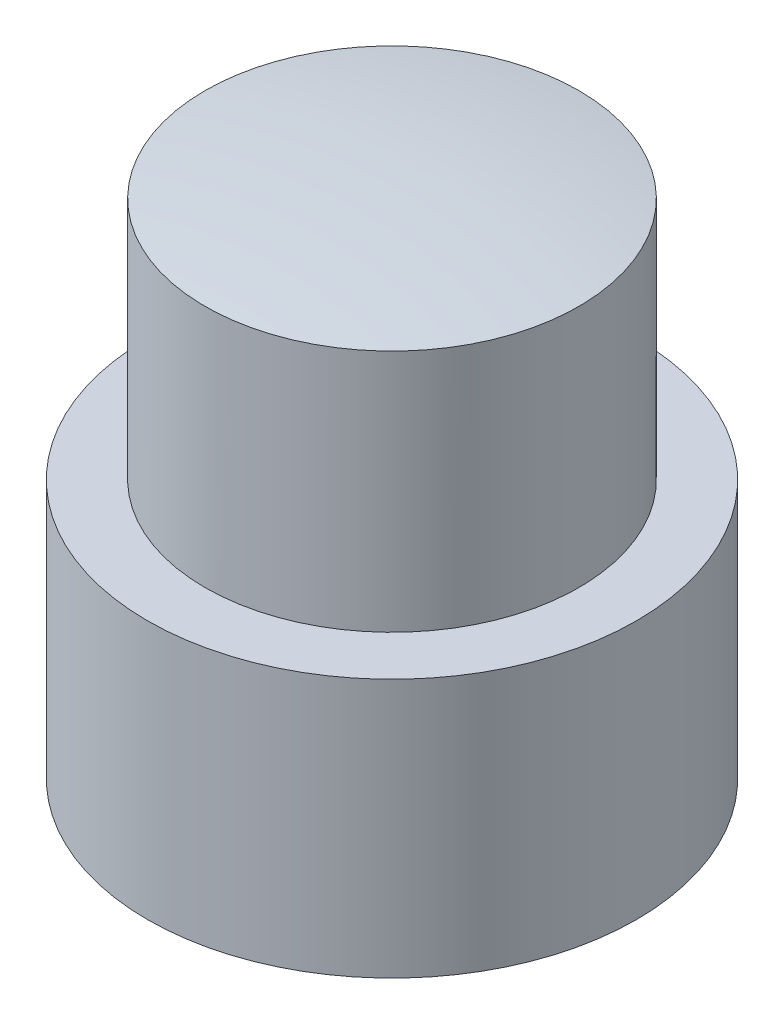
ISO-10303-21;
HEADER;
FILE_DESCRIPTION(('STEP AP214'),'2;1');
FILE_NAME('part.step','',(''),(''),'','','');
FILE_SCHEMA(('AUTOMOTIVE_DESIGN { 1 0 10303 214 1 1 1 1 }'));
ENDSEC;
DATA;
#1=APPLICATION_CONTEXT('core data for automotive mechanical design processes');
#2=APPLICATION_PROTOCOL_DEFINITION('international standard','automotive_design',2000,#1);
#3=PRODUCT_CONTEXT('',#1,'mechanical');
#4=PRODUCT('Part','Part','',(#3));
#5=PRODUCT_RELATED_PRODUCT_CATEGORY('part','',(#4));
#6=PRODUCT_DEFINITION_FORMATION('','',#4);
#7=PRODUCT_DEFINITION_CONTEXT('part definition',#1,'design');
#8=PRODUCT_DEFINITION('design','',#6,#7);
#9=PRODUCT_DEFINITION_SHAPE('','',#8);
#10=(LENGTH_UNIT() NAMED_UNIT(*) SI_UNIT(.MILLI.,.METRE.));
#11=(NAMED_UNIT(*) PLANE_ANGLE_UNIT() SI_UNIT($,.RADIAN.));
#12=(NAMED_UNIT(*) SI_UNIT($,.STERADIAN.) SOLID_ANGLE_UNIT());
#13=UNCERTAINTY_MEASURE_WITH_UNIT(LENGTH_MEASURE(1.E-05),#10,'distance_accuracy_value','');
#14=(GEOMETRIC_REPRESENTATION_CONTEXT(3) GLOBAL_UNCERTAINTY_ASSIGNED_CONTEXT((#13)) GLOBAL_UNIT_ASSIGNED_CONTEXT((#10,
#11,#12)) REPRESENTATION_CONTEXT('',''));
#15=CARTESIAN_POINT('',(0.,0.,0.));
#16=DIRECTION('',(0.,0.,1.));
#17=DIRECTION('',(1.,0.,0.));
#18=AXIS2_PLACEMENT_3D('',#15,#16,#17);
#19=CARTESIAN_POINT('',(-4.25,0.,0.));
#20=DIRECTION('',(0.,1.,0.));
#21=DIRECTION('',(0.,0.,1.));
#22=AXIS2_PLACEMENT_3D('',#19,#20,#21);
#23=PLANE('',#22);
#24=CARTESIAN_POINT('',(0.,0.,0.));
#25=DIRECTION('',(0.,-1.,0.));
#26=DIRECTION('',(0.,0.,-1.));
#27=AXIS2_PLACEMENT_3D('',#24,#25,#26);
#28=CIRCLE('',#27,1.75);
#29=CARTESIAN_POINT('',(0.,0.,-1.75));
#30=VERTEX_POINT('',#29);
#31=EDGE_CURVE('E10',#30,#30,#28,.T.);
#32=ORIENTED_EDGE('',*,*,#31,.F.);
#33=EDGE_LOOP('',(#32));
#34=FACE_BOUND('',#33,.T.);
#35=CARTESIAN_POINT('',(0.,0.,0.));
#36=DIRECTION('',(0.,-1.,0.));
#37=DIRECTION('',(0.,0.,-1.));
#38=AXIS2_PLACEMENT_3D('',#35,#36,#37);
#39=CIRCLE('',#38,4.25);
#40=CARTESIAN_POINT('',(0.,0.,-4.25));
#41=VERTEX_POINT('',#40);
#42=EDGE_CURVE('E52',#41,#41,#39,.T.);
#43=ORIENTED_EDGE('',*,*,#42,.T.);
#44=EDGE_LOOP('',(#43));
#45=FACE_BOUND('',#44,.T.);
#46=ADVANCED_FACE('F30',(#34,#45),#23,.F.);
#47=CARTESIAN_POINT('',(0.,2.,0.));
#48=DIRECTION('',(0.,-1.,0.));
#49=DIRECTION('',(0.,0.,-1.));
#50=AXIS2_PLACEMENT_3D('',#47,#48,#49);
#51=CYLINDRICAL_SURFACE('',#50,1.75);
#52=CARTESIAN_POINT('',(0.,2.,0.));
#53=DIRECTION('',(0.,-1.,0.));
#54=DIRECTION('',(0.,0.,-1.));
#55=AXIS2_PLACEMENT_3D('',#52,#53,#54);
#56=CIRCLE('',#55,1.75);
#57=CARTESIAN_POINT('',(0.,2.,-1.75));
#58=VERTEX_POINT('',#57);
#59=EDGE_CURVE('E36',#58,#58,#56,.T.);
#60=ORIENTED_EDGE('',*,*,#59,.F.);
#61=EDGE_LOOP('',(#60));
#62=FACE_BOUND('',#61,.T.);
#63=ORIENTED_EDGE('',*,*,#31,.T.);
#64=EDGE_LOOP('',(#63));
#65=FACE_BOUND('',#64,.T.);
#66=ADVANCED_FACE('F82',(#62,#65),#51,.F.);
#67=CARTESIAN_POINT('',(-1.75,2.,0.));
#68=DIRECTION('',(0.,1.,0.));
#69=DIRECTION('',(0.,0.,1.));
#70=AXIS2_PLACEMENT_3D('',#67,#68,#69);
#71=PLANE('',#70);
#72=ORIENTED_EDGE('',*,*,#59,.T.);
#73=EDGE_LOOP('',(#72));
#74=FACE_BOUND('',#73,.T.);
#75=ADVANCED_FACE('F77',(#74),#71,.F.);
#76=CARTESIAN_POINT('',(0.,-11.,0.));
#77=DIRECTION('',(0.,-1.,0.));
#78=DIRECTION('',(-1.,0.,0.));
#79=AXIS2_PLACEMENT_3D('',#76,#77,#78);
#80=SPHERICAL_SURFACE('',#79,20.);
#81=CARTESIAN_POINT('',(0.,8.73417087186589,0.));
#82=DIRECTION('',(0.,-1.,0.));
#83=DIRECTION('',(0.,0.,-1.));
#84=AXIS2_PLACEMENT_3D('',#81,#82,#83);
#85=CIRCLE('',#84,3.25);
#86=CARTESIAN_POINT('',(0.,8.73417087186589,-3.25));
#87=VERTEX_POINT('',#86);
#88=EDGE_CURVE('E40',#87,#87,#85,.T.);
#89=ORIENTED_EDGE('',*,*,#88,.F.);
#90=EDGE_LOOP('',(#89));
#91=FACE_BOUND('',#90,.T.);
#92=ADVANCED_FACE('F72',(#91),#80,.T.);
#93=CARTESIAN_POINT('',(0.,2.,0.));
#94=DIRECTION('',(0.,-1.,0.));
#95=DIRECTION('',(0.,0.,-1.));
#96=AXIS2_PLACEMENT_3D('',#93,#94,#95);
#97=CYLINDRICAL_SURFACE('',#96,3.25);
#98=CARTESIAN_POINT('',(0.,4.5,0.));
#99=DIRECTION('',(0.,-1.,0.));
#100=DIRECTION('',(0.,0.,-1.));
#101=AXIS2_PLACEMENT_3D('',#98,#99,#100);
#102=CIRCLE('',#101,3.25);
#103=CARTESIAN_POINT('',(0.,4.5,-3.25));
#104=VERTEX_POINT('',#103);
#105=EDGE_CURVE('E44',#104,#104,#102,.T.);
#106=ORIENTED_EDGE('',*,*,#105,.F.);
#107=EDGE_LOOP('',(#106));
#108=FACE_BOUND('',#107,.T.);
#109=ORIENTED_EDGE('',*,*,#88,.T.);
#110=EDGE_LOOP('',(#109));
#111=FACE_BOUND('',#110,.T.);
#112=ADVANCED_FACE('F66',(#108,#111),#97,.T.);
#113=CARTESIAN_POINT('',(-3.25,4.5,0.));
#114=DIRECTION('',(0.,-1.,0.));
#115=DIRECTION('',(0.,0.,-1.));
#116=AXIS2_PLACEMENT_3D('',#113,#114,#115);
#117=PLANE('',#116);
#118=CARTESIAN_POINT('',(0.,4.5,0.));
#119=DIRECTION('',(0.,-1.,0.));
#120=DIRECTION('',(0.,0.,-1.));
#121=AXIS2_PLACEMENT_3D('',#118,#119,#120);
#122=CIRCLE('',#121,4.25);
#123=CARTESIAN_POINT('',(0.,4.5,-4.25));
#124=VERTEX_POINT('',#123);
#125=EDGE_CURVE('E49',#124,#124,#122,.T.);
#126=ORIENTED_EDGE('',*,*,#125,.F.);
#127=EDGE_LOOP('',(#126));
#128=FACE_BOUND('',#127,.T.);
#129=ORIENTED_EDGE('',*,*,#105,.T.);
#130=EDGE_LOOP('',(#129));
#131=FACE_BOUND('',#130,.T.);
#132=ADVANCED_FACE('F60',(#128,#131),#117,.F.);
#133=CARTESIAN_POINT('',(0.,2.,0.));
#134=DIRECTION('',(0.,-1.,0.));
#135=DIRECTION('',(0.,0.,-1.));
#136=AXIS2_PLACEMENT_3D('',#133,#134,#135);
#137=CYLINDRICAL_SURFACE('',#136,4.25);
#138=ORIENTED_EDGE('',*,*,#42,.F.);
#139=EDGE_LOOP('',(#138));
#140=FACE_BOUND('',#139,.T.);
#141=ORIENTED_EDGE('',*,*,#125,.T.);
#142=EDGE_LOOP('',(#141));
#143=FACE_BOUND('',#142,.T.);
#144=ADVANCED_FACE('F57',(#140,#143),#137,.T.);
#145=CLOSED_SHELL('',(#46,#66,#75,#92,#112,#132,#144));
#146=MANIFOLD_SOLID_BREP('B2',#145);
#147=ADVANCED_BREP_SHAPE_REPRESENTATION('',(#18,#146),#14);
#148=SHAPE_DEFINITION_REPRESENTATION(#9,#147);
ENDSEC;
END-ISO-10303-21;
